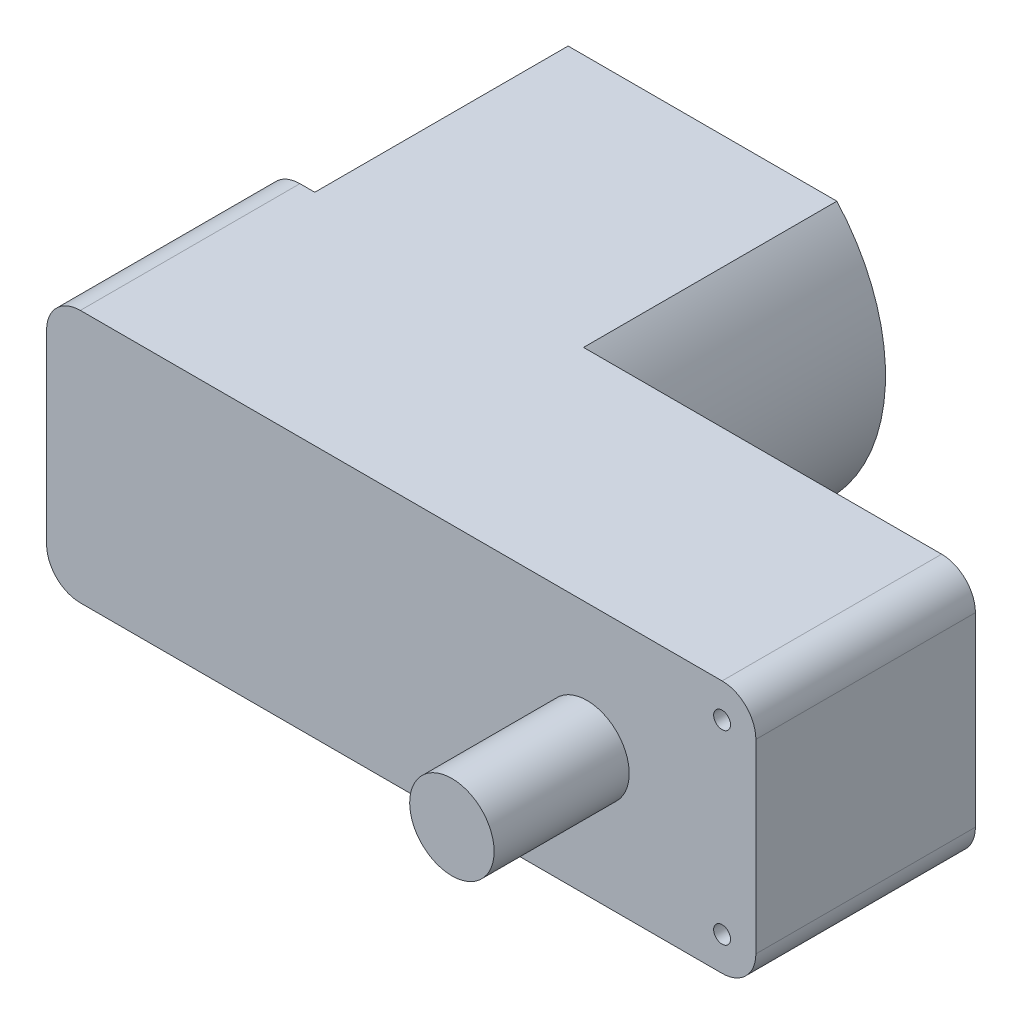
ISO-10303-21;
HEADER;
FILE_DESCRIPTION(('STEP AP214'),'2;1');
FILE_NAME('part.step','',(''),(''),'','','');
FILE_SCHEMA(('AUTOMOTIVE_DESIGN { 1 0 10303 214 1 1 1 1 }'));
ENDSEC;
DATA;
#1=APPLICATION_CONTEXT('core data for automotive mechanical design processes');
#2=APPLICATION_PROTOCOL_DEFINITION('international standard','automotive_design',2000,#1);
#3=PRODUCT_CONTEXT('',#1,'mechanical');
#4=PRODUCT('Part','Part','',(#3));
#5=PRODUCT_RELATED_PRODUCT_CATEGORY('part','',(#4));
#6=PRODUCT_DEFINITION_FORMATION('','',#4);
#7=PRODUCT_DEFINITION_CONTEXT('part definition',#1,'design');
#8=PRODUCT_DEFINITION('design','',#6,#7);
#9=PRODUCT_DEFINITION_SHAPE('','',#8);
#10=(LENGTH_UNIT() NAMED_UNIT(*) SI_UNIT(.MILLI.,.METRE.));
#11=(NAMED_UNIT(*) PLANE_ANGLE_UNIT() SI_UNIT($,.RADIAN.));
#12=(NAMED_UNIT(*) SI_UNIT($,.STERADIAN.) SOLID_ANGLE_UNIT());
#13=UNCERTAINTY_MEASURE_WITH_UNIT(LENGTH_MEASURE(1.E-05),#10,'distance_accuracy_value','');
#14=(GEOMETRIC_REPRESENTATION_CONTEXT(3) GLOBAL_UNCERTAINTY_ASSIGNED_CONTEXT((#13)) GLOBAL_UNIT_ASSIGNED_CONTEXT((#10,
#11,#12)) REPRESENTATION_CONTEXT('',''));
#15=CARTESIAN_POINT('',(0.,0.,0.));
#16=DIRECTION('',(0.,0.,1.));
#17=DIRECTION('',(1.,0.,0.));
#18=AXIS2_PLACEMENT_3D('',#15,#16,#17);
#19=CARTESIAN_POINT('',(0.,6.5,15.));
#20=DIRECTION('',(0.,1.,0.));
#21=DIRECTION('',(0.,0.,1.));
#22=AXIS2_PLACEMENT_3D('',#19,#20,#21);
#23=PLANE('',#22);
#24=DIRECTION('',(1.,0.,0.));
#25=VECTOR('',#24,1.);
#26=CARTESIAN_POINT('',(0.,6.5,0.));
#27=LINE('',#26,#25);
#28=CARTESIAN_POINT('',(-7.5,6.5,0.));
#29=VERTEX_POINT('',#28);
#30=CARTESIAN_POINT('',(7.5,6.5,0.));
#31=VERTEX_POINT('',#30);
#32=EDGE_CURVE('E230',#29,#31,#27,.T.);
#33=ORIENTED_EDGE('',*,*,#32,.T.);
#34=DIRECTION('',(0.,0.,-1.));
#35=VECTOR('',#34,1.);
#36=CARTESIAN_POINT('',(7.5,6.5,15.));
#37=LINE('',#36,#35);
#38=CARTESIAN_POINT('',(7.5,6.5,15.));
#39=VERTEX_POINT('',#38);
#40=EDGE_CURVE('E255',#39,#31,#37,.T.);
#41=ORIENTED_EDGE('',*,*,#40,.F.);
#42=DIRECTION('',(1.,0.,0.));
#43=VECTOR('',#42,1.);
#44=CARTESIAN_POINT('',(0.,6.5,15.));
#45=LINE('',#44,#43);
#46=CARTESIAN_POINT('',(-7.5,6.5,15.));
#47=VERTEX_POINT('',#46);
#48=EDGE_CURVE('E197',#47,#39,#45,.T.);
#49=ORIENTED_EDGE('',*,*,#48,.F.);
#50=DIRECTION('',(0.,0.,-1.));
#51=VECTOR('',#50,1.);
#52=CARTESIAN_POINT('',(-7.5,6.5,15.));
#53=LINE('',#52,#51);
#54=EDGE_CURVE('E245',#47,#29,#53,.T.);
#55=ORIENTED_EDGE('',*,*,#54,.T.);
#56=EDGE_LOOP('',(#33,#41,#49,#55));
#57=FACE_BOUND('',#56,.T.);
#58=ADVANCED_FACE('F41',(#57),#23,.F.);
#59=CARTESIAN_POINT('',(-0.360661549767939,0.,15.));
#60=DIRECTION('',(0.,0.,-1.));
#61=DIRECTION('',(-1.,0.,0.));
#62=AXIS2_PLACEMENT_3D('',#59,#60,#61);
#63=CYLINDRICAL_SURFACE('',#62,10.2);
#64=CARTESIAN_POINT('',(-0.360661549767939,0.,0.));
#65=DIRECTION('',(0.,0.,1.));
#66=DIRECTION('',(1.,0.,0.));
#67=AXIS2_PLACEMENT_3D('',#64,#65,#66);
#68=CIRCLE('',#67,10.2);
#69=CARTESIAN_POINT('',(7.5,-6.5,0.));
#70=VERTEX_POINT('',#69);
#71=EDGE_CURVE('E234',#31,#70,#68,.F.);
#72=ORIENTED_EDGE('',*,*,#71,.T.);
#73=DIRECTION('',(0.,0.,-1.));
#74=VECTOR('',#73,1.);
#75=CARTESIAN_POINT('',(7.5,-6.5,15.));
#76=LINE('',#75,#74);
#77=CARTESIAN_POINT('',(7.5,-6.5,15.));
#78=VERTEX_POINT('',#77);
#79=EDGE_CURVE('E252',#78,#70,#76,.T.);
#80=ORIENTED_EDGE('',*,*,#79,.F.);
#81=CARTESIAN_POINT('',(-0.360661549767939,0.,15.));
#82=DIRECTION('',(0.,0.,1.));
#83=DIRECTION('',(1.,0.,0.));
#84=AXIS2_PLACEMENT_3D('',#81,#82,#83);
#85=CIRCLE('',#84,10.2);
#86=EDGE_CURVE('E205',#39,#78,#85,.F.);
#87=ORIENTED_EDGE('',*,*,#86,.F.);
#88=ORIENTED_EDGE('',*,*,#40,.T.);
#89=EDGE_LOOP('',(#72,#80,#87,#88));
#90=FACE_BOUND('',#89,.T.);
#91=ADVANCED_FACE('F386',(#90),#63,.F.);
#92=CARTESIAN_POINT('',(0.,-6.5,15.));
#93=DIRECTION('',(0.,1.,0.));
#94=DIRECTION('',(0.,0.,1.));
#95=AXIS2_PLACEMENT_3D('',#92,#93,#94);
#96=PLANE('',#95);
#97=DIRECTION('',(1.,0.,0.));
#98=VECTOR('',#97,1.);
#99=CARTESIAN_POINT('',(0.,-6.5,0.));
#100=LINE('',#99,#98);
#101=CARTESIAN_POINT('',(-7.5,-6.5,0.));
#102=VERTEX_POINT('',#101);
#103=EDGE_CURVE('E238',#102,#70,#100,.T.);
#104=ORIENTED_EDGE('',*,*,#103,.F.);
#105=DIRECTION('',(0.,0.,-1.));
#106=VECTOR('',#105,1.);
#107=CARTESIAN_POINT('',(-7.5,-6.5,15.));
#108=LINE('',#107,#106);
#109=CARTESIAN_POINT('',(-7.5,-6.5,15.));
#110=VERTEX_POINT('',#109);
#111=EDGE_CURVE('E248',#110,#102,#108,.T.);
#112=ORIENTED_EDGE('',*,*,#111,.F.);
#113=DIRECTION('',(1.,0.,0.));
#114=VECTOR('',#113,1.);
#115=CARTESIAN_POINT('',(0.,-6.5,15.));
#116=LINE('',#115,#114);
#117=EDGE_CURVE('E208',#110,#78,#116,.T.);
#118=ORIENTED_EDGE('',*,*,#117,.T.);
#119=ORIENTED_EDGE('',*,*,#79,.T.);
#120=EDGE_LOOP('',(#104,#112,#118,#119));
#121=FACE_BOUND('',#120,.T.);
#122=ADVANCED_FACE('F392',(#121),#96,.T.);
#123=CARTESIAN_POINT('',(-0.360661549767939,0.,15.));
#124=DIRECTION('',(0.,0.,-1.));
#125=DIRECTION('',(-1.,0.,0.));
#126=AXIS2_PLACEMENT_3D('',#123,#124,#125);
#127=CYLINDRICAL_SURFACE('',#126,11.2);
#128=CARTESIAN_POINT('',(-0.360661549767939,0.,0.));
#129=DIRECTION('',(0.,0.,1.));
#130=DIRECTION('',(1.,0.,0.));
#131=AXIS2_PLACEMENT_3D('',#128,#129,#130);
#132=CIRCLE('',#131,11.2);
#133=CARTESIAN_POINT('',(7.95739110695407,7.5,0.));
#134=VERTEX_POINT('',#133);
#135=CARTESIAN_POINT('',(7.95739110695407,-7.5,0.));
#136=VERTEX_POINT('',#135);
#137=EDGE_CURVE('E216',#134,#136,#132,.F.);
#138=ORIENTED_EDGE('',*,*,#137,.F.);
#139=DIRECTION('',(0.,0.,-1.));
#140=VECTOR('',#139,1.);
#141=CARTESIAN_POINT('',(7.95739110695407,7.5,15.));
#142=LINE('',#141,#140);
#143=CARTESIAN_POINT('',(7.95739110695407,7.5,15.));
#144=VERTEX_POINT('',#143);
#145=EDGE_CURVE('E249',#144,#134,#142,.T.);
#146=ORIENTED_EDGE('',*,*,#145,.F.);
#147=CARTESIAN_POINT('',(-0.360661549767939,0.,15.));
#148=DIRECTION('',(0.,0.,1.));
#149=DIRECTION('',(1.,0.,0.));
#150=AXIS2_PLACEMENT_3D('',#147,#148,#149);
#151=CIRCLE('',#150,11.2);
#152=CARTESIAN_POINT('',(7.95739110695407,-7.5,15.));
#153=VERTEX_POINT('',#152);
#154=EDGE_CURVE('E193',#144,#153,#151,.F.);
#155=ORIENTED_EDGE('',*,*,#154,.T.);
#156=DIRECTION('',(0.,0.,-1.));
#157=VECTOR('',#156,1.);
#158=CARTESIAN_POINT('',(7.95739110695407,-7.5,15.));
#159=LINE('',#158,#157);
#160=EDGE_CURVE('E185',#153,#136,#159,.T.);
#161=ORIENTED_EDGE('',*,*,#160,.T.);
#162=EDGE_LOOP('',(#138,#146,#155,#161));
#163=FACE_BOUND('',#162,.T.);
#164=ADVANCED_FACE('F405',(#163),#127,.T.);
#165=CARTESIAN_POINT('',(0.,7.5,15.));
#166=DIRECTION('',(0.,1.,0.));
#167=DIRECTION('',(0.,0.,1.));
#168=AXIS2_PLACEMENT_3D('',#165,#166,#167);
#169=PLANE('',#168);
#170=DIRECTION('',(-1.,0.,0.));
#171=VECTOR('',#170,1.);
#172=CARTESIAN_POINT('',(-10.8393384502321,7.5,15.));
#173=LINE('',#172,#171);
#174=CARTESIAN_POINT('',(-7.95739110695407,7.5,15.));
#175=VERTEX_POINT('',#174);
#176=CARTESIAN_POINT('',(-8.83933845023207,7.5,15.));
#177=VERTEX_POINT('',#176);
#178=EDGE_CURVE('E339',#175,#177,#173,.T.);
#179=ORIENTED_EDGE('',*,*,#178,.T.);
#180=DIRECTION('',(0.,0.,-1.));
#181=VECTOR('',#180,1.);
#182=CARTESIAN_POINT('',(-8.83933845023207,7.5,28.));
#183=LINE('',#182,#181);
#184=CARTESIAN_POINT('',(-8.83933845023207,7.5,28.));
#185=VERTEX_POINT('',#184);
#186=EDGE_CURVE('E279',#177,#185,#183,.F.);
#187=ORIENTED_EDGE('',*,*,#186,.T.);
#188=DIRECTION('',(-1.,0.,0.));
#189=VECTOR('',#188,1.);
#190=CARTESIAN_POINT('',(-10.8393384502321,7.5,28.));
#191=LINE('',#190,#189);
#192=CARTESIAN_POINT('',(29.1606615497679,7.50000000000001,28.));
#193=VERTEX_POINT('',#192);
#194=EDGE_CURVE('E342',#193,#185,#191,.T.);
#195=ORIENTED_EDGE('',*,*,#194,.F.);
#196=DIRECTION('',(0.,0.,-1.));
#197=VECTOR('',#196,1.);
#198=CARTESIAN_POINT('',(29.1606615497679,7.5,15.));
#199=LINE('',#198,#197);
#200=CARTESIAN_POINT('',(29.1606615497679,7.50000000000001,15.));
#201=VERTEX_POINT('',#200);
#202=EDGE_CURVE('E275',#193,#201,#199,.T.);
#203=ORIENTED_EDGE('',*,*,#202,.T.);
#204=EDGE_CURVE('E336',#201,#144,#173,.T.);
#205=ORIENTED_EDGE('',*,*,#204,.T.);
#206=ORIENTED_EDGE('',*,*,#145,.T.);
#207=DIRECTION('',(1.,0.,0.));
#208=VECTOR('',#207,1.);
#209=CARTESIAN_POINT('',(0.,7.5,0.));
#210=LINE('',#209,#208);
#211=CARTESIAN_POINT('',(-7.95739110695407,7.5,0.));
#212=VERTEX_POINT('',#211);
#213=EDGE_CURVE('E220',#212,#134,#210,.T.);
#214=ORIENTED_EDGE('',*,*,#213,.F.);
#215=DIRECTION('',(0.,0.,-1.));
#216=VECTOR('',#215,1.);
#217=CARTESIAN_POINT('',(-7.95739110695407,7.5,15.));
#218=LINE('',#217,#216);
#219=EDGE_CURVE('E184',#175,#212,#218,.T.);
#220=ORIENTED_EDGE('',*,*,#219,.F.);
#221=EDGE_LOOP('',(#179,#187,#195,#203,#205,#206,#214,#220));
#222=FACE_BOUND('',#221,.T.);
#223=ADVANCED_FACE('F402',(#222),#169,.T.);
#224=CARTESIAN_POINT('',(0.360661549767929,0.,15.));
#225=DIRECTION('',(0.,0.,-1.));
#226=DIRECTION('',(-1.,0.,0.));
#227=AXIS2_PLACEMENT_3D('',#224,#225,#226);
#228=CYLINDRICAL_SURFACE('',#227,11.2);
#229=CARTESIAN_POINT('',(0.360661549767929,0.,0.));
#230=DIRECTION('',(0.,0.,1.));
#231=DIRECTION('',(1.,0.,0.));
#232=AXIS2_PLACEMENT_3D('',#229,#230,#231);
#233=CIRCLE('',#232,11.2);
#234=CARTESIAN_POINT('',(-7.95739110695407,-7.5,0.));
#235=VERTEX_POINT('',#234);
#236=EDGE_CURVE('E182',#212,#235,#233,.T.);
#237=ORIENTED_EDGE('',*,*,#236,.T.);
#238=DIRECTION('',(0.,0.,-1.));
#239=VECTOR('',#238,1.);
#240=CARTESIAN_POINT('',(-7.95739110695407,-7.5,15.));
#241=LINE('',#240,#239);
#242=CARTESIAN_POINT('',(-7.95739110695407,-7.5,15.));
#243=VERTEX_POINT('',#242);
#244=EDGE_CURVE('E165',#243,#235,#241,.T.);
#245=ORIENTED_EDGE('',*,*,#244,.F.);
#246=CARTESIAN_POINT('',(0.360661549767929,0.,15.));
#247=DIRECTION('',(0.,0.,1.));
#248=DIRECTION('',(1.,0.,0.));
#249=AXIS2_PLACEMENT_3D('',#246,#247,#248);
#250=CIRCLE('',#249,11.2);
#251=CARTESIAN_POINT('',(-10.8393384502321,0.,15.));
#252=VERTEX_POINT('',#251);
#253=EDGE_CURVE('E179',#252,#243,#250,.T.);
#254=ORIENTED_EDGE('',*,*,#253,.F.);
#255=EDGE_CURVE('E192',#175,#252,#250,.T.);
#256=ORIENTED_EDGE('',*,*,#255,.F.);
#257=ORIENTED_EDGE('',*,*,#219,.T.);
#258=EDGE_LOOP('',(#237,#245,#254,#256,#257));
#259=FACE_BOUND('',#258,.T.);
#260=ADVANCED_FACE('F177',(#259),#228,.T.);
#261=CARTESIAN_POINT('',(0.,-7.5,15.));
#262=DIRECTION('',(0.,1.,0.));
#263=DIRECTION('',(0.,0.,1.));
#264=AXIS2_PLACEMENT_3D('',#261,#262,#263);
#265=PLANE('',#264);
#266=DIRECTION('',(1.,0.,0.));
#267=VECTOR('',#266,1.);
#268=CARTESIAN_POINT('',(-10.8393384502321,-7.5,28.));
#269=LINE('',#268,#267);
#270=CARTESIAN_POINT('',(-8.83933845023207,-7.5,28.));
#271=VERTEX_POINT('',#270);
#272=CARTESIAN_POINT('',(29.1606615497679,-7.49999999999999,28.));
#273=VERTEX_POINT('',#272);
#274=EDGE_CURVE('E325',#271,#273,#269,.T.);
#275=ORIENTED_EDGE('',*,*,#274,.F.);
#276=DIRECTION('',(0.,0.,-1.));
#277=VECTOR('',#276,1.);
#278=CARTESIAN_POINT('',(-8.83933845023207,-7.5,15.));
#279=LINE('',#278,#277);
#280=CARTESIAN_POINT('',(-8.83933845023207,-7.5,15.));
#281=VERTEX_POINT('',#280);
#282=EDGE_CURVE('E168',#271,#281,#279,.T.);
#283=ORIENTED_EDGE('',*,*,#282,.T.);
#284=DIRECTION('',(1.,0.,0.));
#285=VECTOR('',#284,1.);
#286=CARTESIAN_POINT('',(-10.8393384502321,-7.5,15.));
#287=LINE('',#286,#285);
#288=EDGE_CURVE('E160',#281,#243,#287,.T.);
#289=ORIENTED_EDGE('',*,*,#288,.T.);
#290=ORIENTED_EDGE('',*,*,#244,.T.);
#291=DIRECTION('',(1.,0.,0.));
#292=VECTOR('',#291,1.);
#293=CARTESIAN_POINT('',(0.,-7.5,0.));
#294=LINE('',#293,#292);
#295=EDGE_CURVE('E227',#235,#136,#294,.T.);
#296=ORIENTED_EDGE('',*,*,#295,.T.);
#297=ORIENTED_EDGE('',*,*,#160,.F.);
#298=CARTESIAN_POINT('',(29.1606615497679,-7.49999999999999,15.));
#299=VERTEX_POINT('',#298);
#300=EDGE_CURVE('E173',#153,#299,#287,.T.);
#301=ORIENTED_EDGE('',*,*,#300,.T.);
#302=DIRECTION('',(0.,0.,-1.));
#303=VECTOR('',#302,1.);
#304=CARTESIAN_POINT('',(29.1606615497679,-7.5,15.));
#305=LINE('',#304,#303);
#306=EDGE_CURVE('E294',#299,#273,#305,.F.);
#307=ORIENTED_EDGE('',*,*,#306,.T.);
#308=EDGE_LOOP('',(#275,#283,#289,#290,#296,#297,#301,#307));
#309=FACE_BOUND('',#308,.T.);
#310=ADVANCED_FACE('F163',(#309),#265,.F.);
#311=CARTESIAN_POINT('',(0.360661549767929,0.,15.));
#312=DIRECTION('',(0.,0.,-1.));
#313=DIRECTION('',(-1.,0.,0.));
#314=AXIS2_PLACEMENT_3D('',#311,#312,#313);
#315=CYLINDRICAL_SURFACE('',#314,10.2);
#316=CARTESIAN_POINT('',(0.360661549767929,0.,0.));
#317=DIRECTION('',(0.,0.,1.));
#318=DIRECTION('',(1.,0.,0.));
#319=AXIS2_PLACEMENT_3D('',#316,#317,#318);
#320=CIRCLE('',#319,10.2);
#321=EDGE_CURVE('E199',#29,#102,#320,.T.);
#322=ORIENTED_EDGE('',*,*,#321,.F.);
#323=ORIENTED_EDGE('',*,*,#54,.F.);
#324=CARTESIAN_POINT('',(0.360661549767929,0.,15.));
#325=DIRECTION('',(0.,0.,1.));
#326=DIRECTION('',(1.,0.,0.));
#327=AXIS2_PLACEMENT_3D('',#324,#325,#326);
#328=CIRCLE('',#327,10.2);
#329=EDGE_CURVE('E212',#47,#110,#328,.T.);
#330=ORIENTED_EDGE('',*,*,#329,.T.);
#331=ORIENTED_EDGE('',*,*,#111,.T.);
#332=EDGE_LOOP('',(#322,#323,#330,#331));
#333=FACE_BOUND('',#332,.T.);
#334=ADVANCED_FACE('F399',(#333),#315,.F.);
#335=CARTESIAN_POINT('',(0.,0.,0.));
#336=DIRECTION('',(0.,0.,1.));
#337=DIRECTION('',(1.,0.,0.));
#338=AXIS2_PLACEMENT_3D('',#335,#336,#337);
#339=PLANE('',#338);
#340=ORIENTED_EDGE('',*,*,#137,.T.);
#341=ORIENTED_EDGE('',*,*,#295,.F.);
#342=ORIENTED_EDGE('',*,*,#236,.F.);
#343=ORIENTED_EDGE('',*,*,#213,.T.);
#344=EDGE_LOOP('',(#340,#341,#342,#343));
#345=FACE_BOUND('',#344,.T.);
#346=ORIENTED_EDGE('',*,*,#32,.F.);
#347=ORIENTED_EDGE('',*,*,#321,.T.);
#348=ORIENTED_EDGE('',*,*,#103,.T.);
#349=ORIENTED_EDGE('',*,*,#71,.F.);
#350=EDGE_LOOP('',(#346,#347,#348,#349));
#351=FACE_BOUND('',#350,.T.);
#352=ADVANCED_FACE('F445',(#345,#351),#339,.F.);
#353=CARTESIAN_POINT('',(0.,0.,15.));
#354=DIRECTION('',(0.,0.,-1.));
#355=DIRECTION('',(-1.,0.,0.));
#356=AXIS2_PLACEMENT_3D('',#353,#354,#355);
#357=PLANE('',#356);
#358=ORIENTED_EDGE('',*,*,#329,.F.);
#359=ORIENTED_EDGE('',*,*,#48,.T.);
#360=ORIENTED_EDGE('',*,*,#86,.T.);
#361=ORIENTED_EDGE('',*,*,#117,.F.);
#362=EDGE_LOOP('',(#358,#359,#360,#361));
#363=FACE_BOUND('',#362,.T.);
#364=ADVANCED_FACE('F450',(#363),#357,.T.);
#365=CARTESIAN_POINT('',(29.1606615497679,-5.50000000000001,15.));
#366=DIRECTION('',(0.,0.,-1.));
#367=DIRECTION('',(-1.,0.,0.));
#368=AXIS2_PLACEMENT_3D('',#365,#366,#367);
#369=CIRCLE('',#368,0.499999999999999);
#370=CARTESIAN_POINT('',(28.6606615497679,-5.50000000000001,15.));
#371=VERTEX_POINT('',#370);
#372=EDGE_CURVE('E362',#371,#371,#369,.F.);
#373=ORIENTED_EDGE('',*,*,#372,.T.);
#374=EDGE_LOOP('',(#373));
#375=FACE_BOUND('',#374,.T.);
#376=CARTESIAN_POINT('',(29.1606615497679,5.50000000000001,15.));
#377=DIRECTION('',(0.,0.,-1.));
#378=DIRECTION('',(-1.,0.,0.));
#379=AXIS2_PLACEMENT_3D('',#376,#377,#378);
#380=CIRCLE('',#379,0.499999999999999);
#381=CARTESIAN_POINT('',(28.6606615497679,5.50000000000001,15.));
#382=VERTEX_POINT('',#381);
#383=EDGE_CURVE('E354',#382,#382,#380,.T.);
#384=ORIENTED_EDGE('',*,*,#383,.F.);
#385=EDGE_LOOP('',(#384));
#386=FACE_BOUND('',#385,.T.);
#387=DIRECTION('',(0.,1.,0.));
#388=VECTOR('',#387,1.);
#389=CARTESIAN_POINT('',(31.1606615497679,7.50000000000001,15.));
#390=LINE('',#389,#388);
#391=CARTESIAN_POINT('',(31.1606615497679,-5.5,15.));
#392=VERTEX_POINT('',#391);
#393=CARTESIAN_POINT('',(31.1606615497679,5.5,15.));
#394=VERTEX_POINT('',#393);
#395=EDGE_CURVE('E172',#392,#394,#390,.T.);
#396=ORIENTED_EDGE('',*,*,#395,.F.);
#397=CARTESIAN_POINT('',(29.1606615497679,-5.5,15.));
#398=DIRECTION('',(0.,0.,-1.));
#399=DIRECTION('',(-1.,0.,0.));
#400=AXIS2_PLACEMENT_3D('',#397,#398,#399);
#401=CIRCLE('',#400,2.);
#402=EDGE_CURVE('E50',#392,#299,#401,.T.);
#403=ORIENTED_EDGE('',*,*,#402,.T.);
#404=ORIENTED_EDGE('',*,*,#300,.F.);
#405=ORIENTED_EDGE('',*,*,#154,.F.);
#406=ORIENTED_EDGE('',*,*,#204,.F.);
#407=CARTESIAN_POINT('',(29.1606615497679,5.5,15.));
#408=DIRECTION('',(0.,0.,-1.));
#409=DIRECTION('',(-1.,0.,0.));
#410=AXIS2_PLACEMENT_3D('',#407,#408,#409);
#411=CIRCLE('',#410,2.);
#412=EDGE_CURVE('E57',#201,#394,#411,.T.);
#413=ORIENTED_EDGE('',*,*,#412,.T.);
#414=EDGE_LOOP('',(#396,#403,#404,#405,#406,#413));
#415=FACE_BOUND('',#414,.T.);
#416=ADVANCED_FACE('F312',(#375,#386,#415),#357,.T.);
#417=DIRECTION('',(0.,-1.,0.));
#418=VECTOR('',#417,1.);
#419=CARTESIAN_POINT('',(-10.8393384502321,7.5,15.));
#420=LINE('',#419,#418);
#421=CARTESIAN_POINT('',(-10.8393384502321,5.5,15.));
#422=VERTEX_POINT('',#421);
#423=EDGE_CURVE('E316',#422,#252,#420,.T.);
#424=ORIENTED_EDGE('',*,*,#423,.F.);
#425=CARTESIAN_POINT('',(-8.83933845023207,5.5,15.));
#426=DIRECTION('',(0.,0.,-1.));
#427=DIRECTION('',(-1.,0.,0.));
#428=AXIS2_PLACEMENT_3D('',#425,#426,#427);
#429=CIRCLE('',#428,2.);
#430=EDGE_CURVE('E272',#422,#177,#429,.T.);
#431=ORIENTED_EDGE('',*,*,#430,.T.);
#432=ORIENTED_EDGE('',*,*,#178,.F.);
#433=ORIENTED_EDGE('',*,*,#255,.T.);
#434=EDGE_LOOP('',(#424,#431,#432,#433));
#435=FACE_BOUND('',#434,.T.);
#436=ADVANCED_FACE('F442',(#435),#357,.T.);
#437=ORIENTED_EDGE('',*,*,#288,.F.);
#438=CARTESIAN_POINT('',(-8.83933845023207,-5.5,15.));
#439=DIRECTION('',(0.,0.,-1.));
#440=DIRECTION('',(-1.,0.,0.));
#441=AXIS2_PLACEMENT_3D('',#438,#439,#440);
#442=CIRCLE('',#441,2.);
#443=CARTESIAN_POINT('',(-10.8393384502321,-5.5,15.));
#444=VERTEX_POINT('',#443);
#445=EDGE_CURVE('E299',#281,#444,#442,.T.);
#446=ORIENTED_EDGE('',*,*,#445,.T.);
#447=EDGE_CURVE('E190',#252,#444,#420,.T.);
#448=ORIENTED_EDGE('',*,*,#447,.F.);
#449=ORIENTED_EDGE('',*,*,#253,.T.);
#450=EDGE_LOOP('',(#437,#446,#448,#449));
#451=FACE_BOUND('',#450,.T.);
#452=ADVANCED_FACE('F188',(#451),#357,.T.);
#453=CARTESIAN_POINT('',(-10.8393384502321,7.5,28.));
#454=DIRECTION('',(1.,0.,0.));
#455=DIRECTION('',(0.,1.,0.));
#456=AXIS2_PLACEMENT_3D('',#453,#454,#455);
#457=PLANE('',#456);
#458=DIRECTION('',(0.,-1.,0.));
#459=VECTOR('',#458,1.);
#460=CARTESIAN_POINT('',(-10.8393384502321,7.5,28.));
#461=LINE('',#460,#459);
#462=CARTESIAN_POINT('',(-10.8393384502321,5.5,28.));
#463=VERTEX_POINT('',#462);
#464=CARTESIAN_POINT('',(-10.8393384502321,-5.5,28.));
#465=VERTEX_POINT('',#464);
#466=EDGE_CURVE('E332',#463,#465,#461,.T.);
#467=ORIENTED_EDGE('',*,*,#466,.F.);
#468=DIRECTION('',(0.,0.,-1.));
#469=VECTOR('',#468,1.);
#470=CARTESIAN_POINT('',(-10.8393384502321,5.5,15.));
#471=LINE('',#470,#469);
#472=EDGE_CURVE('E268',#463,#422,#471,.T.);
#473=ORIENTED_EDGE('',*,*,#472,.T.);
#474=ORIENTED_EDGE('',*,*,#423,.T.);
#475=ORIENTED_EDGE('',*,*,#447,.T.);
#476=DIRECTION('',(0.,0.,-1.));
#477=VECTOR('',#476,1.);
#478=CARTESIAN_POINT('',(-10.8393384502321,-5.5,28.));
#479=LINE('',#478,#477);
#480=EDGE_CURVE('E259',#444,#465,#479,.F.);
#481=ORIENTED_EDGE('',*,*,#480,.T.);
#482=EDGE_LOOP('',(#467,#473,#474,#475,#481));
#483=FACE_BOUND('',#482,.T.);
#484=ADVANCED_FACE('F436',(#483),#457,.F.);
#485=CARTESIAN_POINT('',(31.1606615497679,7.50000000000001,28.));
#486=DIRECTION('',(-1.,0.,0.));
#487=DIRECTION('',(0.,-1.,0.));
#488=AXIS2_PLACEMENT_3D('',#485,#486,#487);
#489=PLANE('',#488);
#490=DIRECTION('',(0.,1.,0.));
#491=VECTOR('',#490,1.);
#492=CARTESIAN_POINT('',(31.1606615497679,7.50000000000001,28.));
#493=LINE('',#492,#491);
#494=CARTESIAN_POINT('',(31.1606615497679,-5.5,28.));
#495=VERTEX_POINT('',#494);
#496=CARTESIAN_POINT('',(31.1606615497679,5.5,28.));
#497=VERTEX_POINT('',#496);
#498=EDGE_CURVE('E221',#495,#497,#493,.T.);
#499=ORIENTED_EDGE('',*,*,#498,.F.);
#500=DIRECTION('',(0.,0.,-1.));
#501=VECTOR('',#500,1.);
#502=CARTESIAN_POINT('',(31.1606615497679,-5.5,28.));
#503=LINE('',#502,#501);
#504=EDGE_CURVE('E305',#495,#392,#503,.T.);
#505=ORIENTED_EDGE('',*,*,#504,.T.);
#506=ORIENTED_EDGE('',*,*,#395,.T.);
#507=DIRECTION('',(0.,0.,-1.));
#508=VECTOR('',#507,1.);
#509=CARTESIAN_POINT('',(31.1606615497679,5.5,28.));
#510=LINE('',#509,#508);
#511=EDGE_CURVE('E302',#394,#497,#510,.F.);
#512=ORIENTED_EDGE('',*,*,#511,.T.);
#513=EDGE_LOOP('',(#499,#505,#506,#512));
#514=FACE_BOUND('',#513,.T.);
#515=ADVANCED_FACE('F327',(#514),#489,.F.);
#516=CARTESIAN_POINT('',(0.,0.,28.));
#517=DIRECTION('',(0.,0.,-1.));
#518=DIRECTION('',(-1.,0.,0.));
#519=AXIS2_PLACEMENT_3D('',#516,#517,#518);
#520=PLANE('',#519);
#521=CARTESIAN_POINT('',(29.1606615497679,-5.50000000000001,28.));
#522=DIRECTION('',(0.,0.,-1.));
#523=DIRECTION('',(1.,0.,0.));
#524=AXIS2_PLACEMENT_3D('',#521,#522,#523);
#525=CIRCLE('',#524,0.499999999999999);
#526=CARTESIAN_POINT('',(29.6606615497679,-5.50000000000001,28.));
#527=VERTEX_POINT('',#526);
#528=EDGE_CURVE('E366',#527,#527,#525,.T.);
#529=ORIENTED_EDGE('',*,*,#528,.T.);
#530=EDGE_LOOP('',(#529));
#531=FACE_BOUND('',#530,.T.);
#532=CARTESIAN_POINT('',(29.1606615497679,5.50000000000001,28.));
#533=DIRECTION('',(0.,0.,1.));
#534=DIRECTION('',(1.,0.,0.));
#535=AXIS2_PLACEMENT_3D('',#532,#533,#534);
#536=CIRCLE('',#535,0.499999999999999);
#537=CARTESIAN_POINT('',(29.6606615497679,5.50000000000001,28.));
#538=VERTEX_POINT('',#537);
#539=EDGE_CURVE('E358',#538,#538,#536,.T.);
#540=ORIENTED_EDGE('',*,*,#539,.F.);
#541=EDGE_LOOP('',(#540));
#542=FACE_BOUND('',#541,.T.);
#543=CARTESIAN_POINT('',(21.1606615497679,0.,28.));
#544=DIRECTION('',(0.,0.,-1.));
#545=DIRECTION('',(-1.,0.,0.));
#546=AXIS2_PLACEMENT_3D('',#543,#544,#545);
#547=CIRCLE('',#546,2.5);
#548=CARTESIAN_POINT('',(18.6606615497679,0.,28.));
#549=VERTEX_POINT('',#548);
#550=EDGE_CURVE('E11',#549,#549,#547,.F.);
#551=ORIENTED_EDGE('',*,*,#550,.F.);
#552=EDGE_LOOP('',(#551));
#553=FACE_BOUND('',#552,.T.);
#554=ORIENTED_EDGE('',*,*,#194,.T.);
#555=CARTESIAN_POINT('',(-8.83933845023207,5.5,28.));
#556=DIRECTION('',(0.,0.,-1.));
#557=DIRECTION('',(-1.,0.,0.));
#558=AXIS2_PLACEMENT_3D('',#555,#556,#557);
#559=CIRCLE('',#558,2.);
#560=EDGE_CURVE('E291',#185,#463,#559,.F.);
#561=ORIENTED_EDGE('',*,*,#560,.T.);
#562=ORIENTED_EDGE('',*,*,#466,.T.);
#563=CARTESIAN_POINT('',(-8.83933845023207,-5.5,28.));
#564=DIRECTION('',(0.,0.,-1.));
#565=DIRECTION('',(-1.,0.,0.));
#566=AXIS2_PLACEMENT_3D('',#563,#564,#565);
#567=CIRCLE('',#566,2.);
#568=EDGE_CURVE('E288',#465,#271,#567,.F.);
#569=ORIENTED_EDGE('',*,*,#568,.T.);
#570=ORIENTED_EDGE('',*,*,#274,.T.);
#571=CARTESIAN_POINT('',(29.1606615497679,-5.5,28.));
#572=DIRECTION('',(0.,0.,-1.));
#573=DIRECTION('',(-1.,0.,0.));
#574=AXIS2_PLACEMENT_3D('',#571,#572,#573);
#575=CIRCLE('',#574,2.);
#576=EDGE_CURVE('E285',#273,#495,#575,.F.);
#577=ORIENTED_EDGE('',*,*,#576,.T.);
#578=ORIENTED_EDGE('',*,*,#498,.T.);
#579=CARTESIAN_POINT('',(29.1606615497679,5.5,28.));
#580=DIRECTION('',(0.,0.,-1.));
#581=DIRECTION('',(-1.,0.,0.));
#582=AXIS2_PLACEMENT_3D('',#579,#580,#581);
#583=CIRCLE('',#582,2.);
#584=EDGE_CURVE('E282',#497,#193,#583,.F.);
#585=ORIENTED_EDGE('',*,*,#584,.T.);
#586=EDGE_LOOP('',(#554,#561,#562,#569,#570,#577,#578,#585));
#587=FACE_BOUND('',#586,.T.);
#588=ADVANCED_FACE('F323',(#531,#542,#553,#587),#520,.F.);
#589=CARTESIAN_POINT('',(-8.83933845023207,5.5,28.));
#590=DIRECTION('',(0.,0.,1.));
#591=DIRECTION('',(1.,0.,0.));
#592=AXIS2_PLACEMENT_3D('',#589,#590,#591);
#593=CYLINDRICAL_SURFACE('',#592,2.);
#594=ORIENTED_EDGE('',*,*,#560,.F.);
#595=ORIENTED_EDGE('',*,*,#186,.F.);
#596=ORIENTED_EDGE('',*,*,#430,.F.);
#597=ORIENTED_EDGE('',*,*,#472,.F.);
#598=EDGE_LOOP('',(#594,#595,#596,#597));
#599=FACE_BOUND('',#598,.T.);
#600=ADVANCED_FACE('F410',(#599),#593,.T.);
#601=CARTESIAN_POINT('',(-8.83933845023207,-5.5,15.));
#602=DIRECTION('',(0.,0.,-1.));
#603=DIRECTION('',(-1.,0.,0.));
#604=AXIS2_PLACEMENT_3D('',#601,#602,#603);
#605=CYLINDRICAL_SURFACE('',#604,2.);
#606=ORIENTED_EDGE('',*,*,#568,.F.);
#607=ORIENTED_EDGE('',*,*,#480,.F.);
#608=ORIENTED_EDGE('',*,*,#445,.F.);
#609=ORIENTED_EDGE('',*,*,#282,.F.);
#610=EDGE_LOOP('',(#606,#607,#608,#609));
#611=FACE_BOUND('',#610,.T.);
#612=ADVANCED_FACE('F413',(#611),#605,.T.);
#613=CARTESIAN_POINT('',(29.1606615497679,-5.5,28.));
#614=DIRECTION('',(0.,0.,-1.));
#615=DIRECTION('',(-1.,0.,0.));
#616=AXIS2_PLACEMENT_3D('',#613,#614,#615);
#617=CYLINDRICAL_SURFACE('',#616,2.);
#618=ORIENTED_EDGE('',*,*,#576,.F.);
#619=ORIENTED_EDGE('',*,*,#306,.F.);
#620=ORIENTED_EDGE('',*,*,#402,.F.);
#621=ORIENTED_EDGE('',*,*,#504,.F.);
#622=EDGE_LOOP('',(#618,#619,#620,#621));
#623=FACE_BOUND('',#622,.T.);
#624=ADVANCED_FACE('F318',(#623),#617,.T.);
#625=CARTESIAN_POINT('',(29.1606615497679,5.5,15.));
#626=DIRECTION('',(0.,0.,1.));
#627=DIRECTION('',(1.,0.,0.));
#628=AXIS2_PLACEMENT_3D('',#625,#626,#627);
#629=CYLINDRICAL_SURFACE('',#628,2.);
#630=ORIENTED_EDGE('',*,*,#584,.F.);
#631=ORIENTED_EDGE('',*,*,#511,.F.);
#632=ORIENTED_EDGE('',*,*,#412,.F.);
#633=ORIENTED_EDGE('',*,*,#202,.F.);
#634=EDGE_LOOP('',(#630,#631,#632,#633));
#635=FACE_BOUND('',#634,.T.);
#636=ADVANCED_FACE('F43',(#635),#629,.T.);
#637=CARTESIAN_POINT('',(21.1606615497679,0.,36.));
#638=DIRECTION('',(0.,0.,-1.));
#639=DIRECTION('',(-1.,0.,0.));
#640=AXIS2_PLACEMENT_3D('',#637,#638,#639);
#641=CYLINDRICAL_SURFACE('',#640,2.5);
#642=CARTESIAN_POINT('',(21.1606615497679,0.,36.));
#643=DIRECTION('',(0.,0.,1.));
#644=DIRECTION('',(1.,0.,0.));
#645=AXIS2_PLACEMENT_3D('',#642,#643,#644);
#646=CIRCLE('',#645,2.5);
#647=CARTESIAN_POINT('',(23.6606615497679,0.,36.));
#648=VERTEX_POINT('',#647);
#649=EDGE_CURVE('E350',#648,#648,#646,.T.);
#650=ORIENTED_EDGE('',*,*,#649,.F.);
#651=EDGE_LOOP('',(#650));
#652=FACE_BOUND('',#651,.T.);
#653=ORIENTED_EDGE('',*,*,#550,.T.);
#654=EDGE_LOOP('',(#653));
#655=FACE_BOUND('',#654,.T.);
#656=ADVANCED_FACE('F421',(#652,#655),#641,.T.);
#657=CARTESIAN_POINT('',(21.1606615497679,0.,36.));
#658=DIRECTION('',(0.,0.,1.));
#659=DIRECTION('',(1.,0.,0.));
#660=AXIS2_PLACEMENT_3D('',#657,#658,#659);
#661=PLANE('',#660);
#662=ORIENTED_EDGE('',*,*,#649,.T.);
#663=EDGE_LOOP('',(#662));
#664=FACE_BOUND('',#663,.T.);
#665=ADVANCED_FACE('F381',(#664),#661,.T.);
#666=CARTESIAN_POINT('',(29.1606615497679,5.50000000000001,0.));
#667=DIRECTION('',(0.,0.,1.));
#668=DIRECTION('',(1.,0.,0.));
#669=AXIS2_PLACEMENT_3D('',#666,#667,#668);
#670=CYLINDRICAL_SURFACE('',#669,0.499999999999999);
#671=ORIENTED_EDGE('',*,*,#383,.T.);
#672=EDGE_LOOP('',(#671));
#673=FACE_BOUND('',#672,.T.);
#674=ORIENTED_EDGE('',*,*,#539,.T.);
#675=EDGE_LOOP('',(#674));
#676=FACE_BOUND('',#675,.T.);
#677=ADVANCED_FACE('F375',(#673,#676),#670,.F.);
#678=CARTESIAN_POINT('',(29.1606615497679,-5.50000000000001,0.));
#679=DIRECTION('',(0.,0.,1.));
#680=DIRECTION('',(1.,0.,0.));
#681=AXIS2_PLACEMENT_3D('',#678,#679,#680);
#682=CYLINDRICAL_SURFACE('',#681,0.499999999999999);
#683=ORIENTED_EDGE('',*,*,#372,.F.);
#684=EDGE_LOOP('',(#683));
#685=FACE_BOUND('',#684,.T.);
#686=ORIENTED_EDGE('',*,*,#528,.F.);
#687=EDGE_LOOP('',(#686));
#688=FACE_BOUND('',#687,.T.);
#689=ADVANCED_FACE('F373',(#685,#688),#682,.F.);
#690=CLOSED_SHELL('',(#58,#91,#122,#164,#223,#260,#310,#334,#352,#364,#416,#436,#452,#484,#515,
#588,#600,#612,#624,#636,#656,#665,#677,#689));
#691=MANIFOLD_SOLID_BREP('B2',#690);
#692=ADVANCED_BREP_SHAPE_REPRESENTATION('',(#18,#691),#14);
#693=SHAPE_DEFINITION_REPRESENTATION(#9,#692);
ENDSEC;
END-ISO-10303-21;
